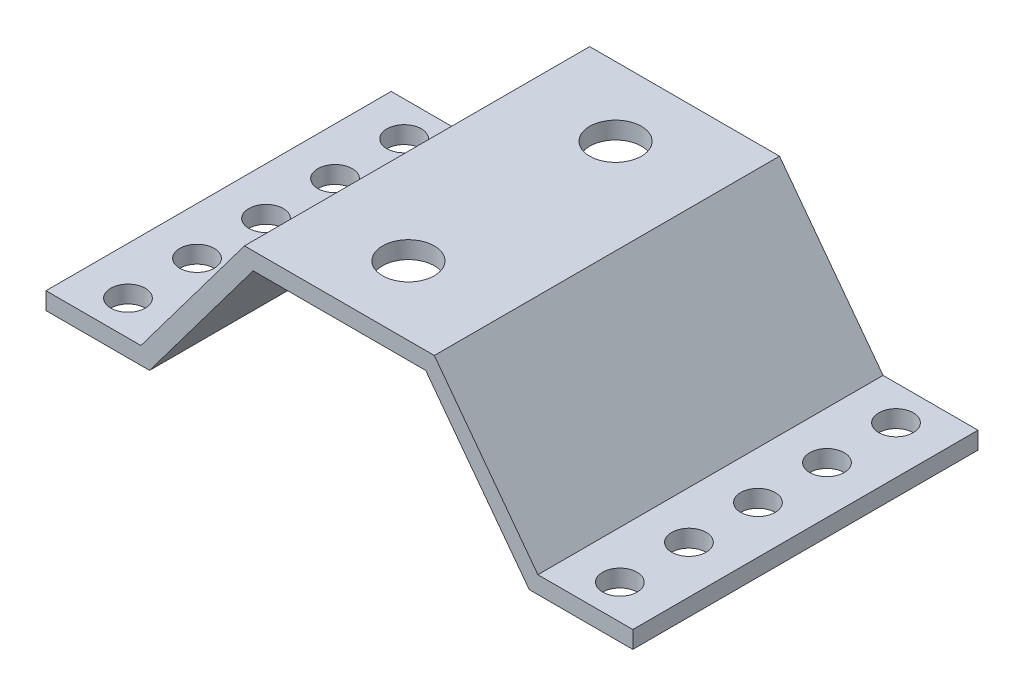
ISO-10303-21;
HEADER;
FILE_DESCRIPTION(('STEP AP214'),'2;1');
FILE_NAME('part.step','',(''),(''),'','','');
FILE_SCHEMA(('AUTOMOTIVE_DESIGN { 1 0 10303 214 1 1 1 1 }'));
ENDSEC;
DATA;
#1=APPLICATION_CONTEXT('core data for automotive mechanical design processes');
#2=APPLICATION_PROTOCOL_DEFINITION('international standard','automotive_design',2000,#1);
#3=PRODUCT_CONTEXT('',#1,'mechanical');
#4=PRODUCT('Part','Part','',(#3));
#5=PRODUCT_RELATED_PRODUCT_CATEGORY('part','',(#4));
#6=PRODUCT_DEFINITION_FORMATION('','',#4);
#7=PRODUCT_DEFINITION_CONTEXT('part definition',#1,'design');
#8=PRODUCT_DEFINITION('design','',#6,#7);
#9=PRODUCT_DEFINITION_SHAPE('','',#8);
#10=(LENGTH_UNIT() NAMED_UNIT(*) SI_UNIT(.MILLI.,.METRE.));
#11=(NAMED_UNIT(*) PLANE_ANGLE_UNIT() SI_UNIT($,.RADIAN.));
#12=(NAMED_UNIT(*) SI_UNIT($,.STERADIAN.) SOLID_ANGLE_UNIT());
#13=UNCERTAINTY_MEASURE_WITH_UNIT(LENGTH_MEASURE(1.E-05),#10,'distance_accuracy_value','');
#14=(GEOMETRIC_REPRESENTATION_CONTEXT(3) GLOBAL_UNCERTAINTY_ASSIGNED_CONTEXT((#13)) GLOBAL_UNIT_ASSIGNED_CONTEXT((#10,
#11,#12)) REPRESENTATION_CONTEXT('',''));
#15=CARTESIAN_POINT('',(0.,0.,0.));
#16=DIRECTION('',(0.,0.,1.));
#17=DIRECTION('',(1.,0.,0.));
#18=AXIS2_PLACEMENT_3D('',#15,#16,#17);
#19=CARTESIAN_POINT('',(-27.5,45.,50.));
#20=DIRECTION('',(0.8,-0.6,0.));
#21=DIRECTION('',(0.6,0.8,0.));
#22=AXIS2_PLACEMENT_3D('',#19,#20,#21);
#23=PLANE('',#22);
#24=DIRECTION('',(-0.6,-0.8,0.));
#25=VECTOR('',#24,1.);
#26=CARTESIAN_POINT('',(-27.5,45.,-50.));
#27=LINE('',#26,#25);
#28=CARTESIAN_POINT('',(-27.5,45.,-50.));
#29=VERTEX_POINT('',#28);
#30=CARTESIAN_POINT('',(-57.5,5.,-50.));
#31=VERTEX_POINT('',#30);
#32=EDGE_CURVE('E161',#29,#31,#27,.T.);
#33=ORIENTED_EDGE('',*,*,#32,.T.);
#34=DIRECTION('',(0.,0.,-1.));
#35=VECTOR('',#34,1.);
#36=CARTESIAN_POINT('',(-57.5,5.,50.));
#37=LINE('',#36,#35);
#38=CARTESIAN_POINT('',(-57.5,5.,50.));
#39=VERTEX_POINT('',#38);
#40=EDGE_CURVE('E11',#39,#31,#37,.T.);
#41=ORIENTED_EDGE('',*,*,#40,.F.);
#42=DIRECTION('',(-0.6,-0.8,0.));
#43=VECTOR('',#42,1.);
#44=CARTESIAN_POINT('',(-27.5,45.,50.));
#45=LINE('',#44,#43);
#46=CARTESIAN_POINT('',(-27.5,45.,50.));
#47=VERTEX_POINT('',#46);
#48=EDGE_CURVE('E184',#47,#39,#45,.T.);
#49=ORIENTED_EDGE('',*,*,#48,.F.);
#50=DIRECTION('',(0.,0.,-1.));
#51=VECTOR('',#50,1.);
#52=CARTESIAN_POINT('',(-27.5,45.,50.));
#53=LINE('',#52,#51);
#54=EDGE_CURVE('E157',#47,#29,#53,.T.);
#55=ORIENTED_EDGE('',*,*,#54,.T.);
#56=EDGE_LOOP('',(#33,#41,#49,#55));
#57=FACE_BOUND('',#56,.T.);
#58=ADVANCED_FACE('F39',(#57),#23,.F.);
#59=CARTESIAN_POINT('',(-57.5,5.,50.));
#60=DIRECTION('',(0.,-1.,0.));
#61=DIRECTION('',(1.,0.,0.));
#62=AXIS2_PLACEMENT_3D('',#59,#60,#61);
#63=PLANE('',#62);
#64=CARTESIAN_POINT('',(-71.25,5.,40.));
#65=DIRECTION('',(0.,-1.,0.));
#66=DIRECTION('',(1.,0.,0.));
#67=AXIS2_PLACEMENT_3D('',#64,#65,#66);
#68=CIRCLE('',#67,5.00000000000001);
#69=CARTESIAN_POINT('',(-66.25,5.,40.));
#70=VERTEX_POINT('',#69);
#71=EDGE_CURVE('E165',#70,#70,#68,.T.);
#72=ORIENTED_EDGE('',*,*,#71,.T.);
#73=EDGE_LOOP('',(#72));
#74=FACE_BOUND('',#73,.T.);
#75=CARTESIAN_POINT('',(-71.25,5.,20.));
#76=DIRECTION('',(0.,-1.,0.));
#77=DIRECTION('',(1.,0.,0.));
#78=AXIS2_PLACEMENT_3D('',#75,#76,#77);
#79=CIRCLE('',#78,5.00000000000001);
#80=CARTESIAN_POINT('',(-66.25,5.,20.));
#81=VERTEX_POINT('',#80);
#82=EDGE_CURVE('E224',#81,#81,#79,.T.);
#83=ORIENTED_EDGE('',*,*,#82,.T.);
#84=EDGE_LOOP('',(#83));
#85=FACE_BOUND('',#84,.T.);
#86=CARTESIAN_POINT('',(-71.25,5.,0.));
#87=DIRECTION('',(0.,-1.,0.));
#88=DIRECTION('',(1.,0.,0.));
#89=AXIS2_PLACEMENT_3D('',#86,#87,#88);
#90=CIRCLE('',#89,5.00000000000001);
#91=CARTESIAN_POINT('',(-66.25,5.,0.));
#92=VERTEX_POINT('',#91);
#93=EDGE_CURVE('E220',#92,#92,#90,.T.);
#94=ORIENTED_EDGE('',*,*,#93,.T.);
#95=EDGE_LOOP('',(#94));
#96=FACE_BOUND('',#95,.T.);
#97=CARTESIAN_POINT('',(-71.25,5.,-20.));
#98=DIRECTION('',(0.,-1.,0.));
#99=DIRECTION('',(1.,0.,0.));
#100=AXIS2_PLACEMENT_3D('',#97,#98,#99);
#101=CIRCLE('',#100,5.00000000000001);
#102=CARTESIAN_POINT('',(-66.25,5.,-20.));
#103=VERTEX_POINT('',#102);
#104=EDGE_CURVE('E216',#103,#103,#101,.T.);
#105=ORIENTED_EDGE('',*,*,#104,.T.);
#106=EDGE_LOOP('',(#105));
#107=FACE_BOUND('',#106,.T.);
#108=CARTESIAN_POINT('',(-71.25,5.,-40.));
#109=DIRECTION('',(0.,-1.,0.));
#110=DIRECTION('',(1.,0.,0.));
#111=AXIS2_PLACEMENT_3D('',#108,#109,#110);
#112=CIRCLE('',#111,5.00000000000001);
#113=CARTESIAN_POINT('',(-66.25,5.,-40.));
#114=VERTEX_POINT('',#113);
#115=EDGE_CURVE('E211',#114,#114,#112,.T.);
#116=ORIENTED_EDGE('',*,*,#115,.T.);
#117=EDGE_LOOP('',(#116));
#118=FACE_BOUND('',#117,.T.);
#119=DIRECTION('',(-1.,0.,0.));
#120=VECTOR('',#119,1.);
#121=CARTESIAN_POINT('',(-57.5,5.,-50.));
#122=LINE('',#121,#120);
#123=CARTESIAN_POINT('',(-85.,5.,-50.));
#124=VERTEX_POINT('',#123);
#125=EDGE_CURVE('E164',#31,#124,#122,.T.);
#126=ORIENTED_EDGE('',*,*,#125,.T.);
#127=DIRECTION('',(0.,0.,-1.));
#128=VECTOR('',#127,1.);
#129=CARTESIAN_POINT('',(-85.,5.,50.));
#130=LINE('',#129,#128);
#131=CARTESIAN_POINT('',(-85.,5.,50.));
#132=VERTEX_POINT('',#131);
#133=EDGE_CURVE('E48',#132,#124,#130,.T.);
#134=ORIENTED_EDGE('',*,*,#133,.F.);
#135=DIRECTION('',(-1.,0.,0.));
#136=VECTOR('',#135,1.);
#137=CARTESIAN_POINT('',(-57.5,5.,50.));
#138=LINE('',#137,#136);
#139=EDGE_CURVE('E112',#39,#132,#138,.T.);
#140=ORIENTED_EDGE('',*,*,#139,.F.);
#141=ORIENTED_EDGE('',*,*,#40,.T.);
#142=EDGE_LOOP('',(#126,#134,#140,#141));
#143=FACE_BOUND('',#142,.T.);
#144=ADVANCED_FACE('F322',(#74,#85,#96,#107,#118,#143),#63,.F.);
#145=CARTESIAN_POINT('',(-85.,5.,50.));
#146=DIRECTION('',(1.,0.,0.));
#147=DIRECTION('',(0.,0.,-1.));
#148=AXIS2_PLACEMENT_3D('',#145,#146,#147);
#149=PLANE('',#148);
#150=DIRECTION('',(0.,-1.,0.));
#151=VECTOR('',#150,1.);
#152=CARTESIAN_POINT('',(-85.,5.,-50.));
#153=LINE('',#152,#151);
#154=CARTESIAN_POINT('',(-85.,0.,-50.));
#155=VERTEX_POINT('',#154);
#156=EDGE_CURVE('E167',#124,#155,#153,.T.);
#157=ORIENTED_EDGE('',*,*,#156,.T.);
#158=DIRECTION('',(0.,0.,-1.));
#159=VECTOR('',#158,1.);
#160=CARTESIAN_POINT('',(-85.,0.,50.));
#161=LINE('',#160,#159);
#162=CARTESIAN_POINT('',(-85.,0.,50.));
#163=VERTEX_POINT('',#162);
#164=EDGE_CURVE('E203',#163,#155,#161,.T.);
#165=ORIENTED_EDGE('',*,*,#164,.F.);
#166=DIRECTION('',(0.,-1.,0.));
#167=VECTOR('',#166,1.);
#168=CARTESIAN_POINT('',(-85.,5.,50.));
#169=LINE('',#168,#167);
#170=EDGE_CURVE('E282',#132,#163,#169,.T.);
#171=ORIENTED_EDGE('',*,*,#170,.F.);
#172=ORIENTED_EDGE('',*,*,#133,.T.);
#173=EDGE_LOOP('',(#157,#165,#171,#172));
#174=FACE_BOUND('',#173,.T.);
#175=ADVANCED_FACE('F326',(#174),#149,.F.);
#176=CARTESIAN_POINT('',(-85.,0.,50.));
#177=DIRECTION('',(0.,1.,0.));
#178=DIRECTION('',(-1.,0.,0.));
#179=AXIS2_PLACEMENT_3D('',#176,#177,#178);
#180=PLANE('',#179);
#181=CARTESIAN_POINT('',(-71.25,0.,40.));
#182=DIRECTION('',(0.,1.,0.));
#183=DIRECTION('',(-1.,0.,0.));
#184=AXIS2_PLACEMENT_3D('',#181,#182,#183);
#185=CIRCLE('',#184,5.00000000000001);
#186=CARTESIAN_POINT('',(-76.25,0.,40.));
#187=VERTEX_POINT('',#186);
#188=EDGE_CURVE('E225',#187,#187,#185,.T.);
#189=ORIENTED_EDGE('',*,*,#188,.T.);
#190=EDGE_LOOP('',(#189));
#191=FACE_BOUND('',#190,.T.);
#192=CARTESIAN_POINT('',(-71.25,0.,20.));
#193=DIRECTION('',(0.,1.,0.));
#194=DIRECTION('',(-1.,0.,0.));
#195=AXIS2_PLACEMENT_3D('',#192,#193,#194);
#196=CIRCLE('',#195,5.00000000000001);
#197=CARTESIAN_POINT('',(-76.25,0.,20.));
#198=VERTEX_POINT('',#197);
#199=EDGE_CURVE('E221',#198,#198,#196,.T.);
#200=ORIENTED_EDGE('',*,*,#199,.T.);
#201=EDGE_LOOP('',(#200));
#202=FACE_BOUND('',#201,.T.);
#203=CARTESIAN_POINT('',(-71.25,0.,0.));
#204=DIRECTION('',(0.,1.,0.));
#205=DIRECTION('',(-1.,0.,0.));
#206=AXIS2_PLACEMENT_3D('',#203,#204,#205);
#207=CIRCLE('',#206,5.00000000000001);
#208=CARTESIAN_POINT('',(-76.25,0.,0.));
#209=VERTEX_POINT('',#208);
#210=EDGE_CURVE('E217',#209,#209,#207,.T.);
#211=ORIENTED_EDGE('',*,*,#210,.T.);
#212=EDGE_LOOP('',(#211));
#213=FACE_BOUND('',#212,.T.);
#214=CARTESIAN_POINT('',(-71.25,0.,-20.));
#215=DIRECTION('',(0.,1.,0.));
#216=DIRECTION('',(-1.,0.,0.));
#217=AXIS2_PLACEMENT_3D('',#214,#215,#216);
#218=CIRCLE('',#217,5.00000000000001);
#219=CARTESIAN_POINT('',(-76.25,0.,-20.));
#220=VERTEX_POINT('',#219);
#221=EDGE_CURVE('E213',#220,#220,#218,.T.);
#222=ORIENTED_EDGE('',*,*,#221,.T.);
#223=EDGE_LOOP('',(#222));
#224=FACE_BOUND('',#223,.T.);
#225=CARTESIAN_POINT('',(-71.25,0.,-40.));
#226=DIRECTION('',(0.,1.,0.));
#227=DIRECTION('',(-1.,0.,0.));
#228=AXIS2_PLACEMENT_3D('',#225,#226,#227);
#229=CIRCLE('',#228,5.00000000000001);
#230=CARTESIAN_POINT('',(-76.25,0.,-40.));
#231=VERTEX_POINT('',#230);
#232=EDGE_CURVE('E208',#231,#231,#229,.T.);
#233=ORIENTED_EDGE('',*,*,#232,.T.);
#234=EDGE_LOOP('',(#233));
#235=FACE_BOUND('',#234,.T.);
#236=DIRECTION('',(1.,0.,0.));
#237=VECTOR('',#236,1.);
#238=CARTESIAN_POINT('',(-85.,0.,-50.));
#239=LINE('',#238,#237);
#240=CARTESIAN_POINT('',(-55.,0.,-50.));
#241=VERTEX_POINT('',#240);
#242=EDGE_CURVE('E169',#155,#241,#239,.T.);
#243=ORIENTED_EDGE('',*,*,#242,.T.);
#244=DIRECTION('',(0.,0.,-1.));
#245=VECTOR('',#244,1.);
#246=CARTESIAN_POINT('',(-55.,0.,50.));
#247=LINE('',#246,#245);
#248=CARTESIAN_POINT('',(-55.,0.,50.));
#249=VERTEX_POINT('',#248);
#250=EDGE_CURVE('E200',#249,#241,#247,.T.);
#251=ORIENTED_EDGE('',*,*,#250,.F.);
#252=DIRECTION('',(1.,0.,0.));
#253=VECTOR('',#252,1.);
#254=CARTESIAN_POINT('',(-85.,0.,50.));
#255=LINE('',#254,#253);
#256=EDGE_CURVE('E284',#163,#249,#255,.T.);
#257=ORIENTED_EDGE('',*,*,#256,.F.);
#258=ORIENTED_EDGE('',*,*,#164,.T.);
#259=EDGE_LOOP('',(#243,#251,#257,#258));
#260=FACE_BOUND('',#259,.T.);
#261=ADVANCED_FACE('F331',(#191,#202,#213,#224,#235,#260),#180,.F.);
#262=CARTESIAN_POINT('',(-55.,0.,50.));
#263=DIRECTION('',(-0.8,0.6,0.));
#264=DIRECTION('',(-0.6,-0.8,0.));
#265=AXIS2_PLACEMENT_3D('',#262,#263,#264);
#266=PLANE('',#265);
#267=DIRECTION('',(0.6,0.8,0.));
#268=VECTOR('',#267,1.);
#269=CARTESIAN_POINT('',(-55.,0.,-50.));
#270=LINE('',#269,#268);
#271=CARTESIAN_POINT('',(-25.,40.,-50.));
#272=VERTEX_POINT('',#271);
#273=EDGE_CURVE('E171',#241,#272,#270,.T.);
#274=ORIENTED_EDGE('',*,*,#273,.T.);
#275=DIRECTION('',(0.,0.,-1.));
#276=VECTOR('',#275,1.);
#277=CARTESIAN_POINT('',(-25.,40.,50.));
#278=LINE('',#277,#276);
#279=CARTESIAN_POINT('',(-25.,40.,50.));
#280=VERTEX_POINT('',#279);
#281=EDGE_CURVE('E197',#280,#272,#278,.T.);
#282=ORIENTED_EDGE('',*,*,#281,.F.);
#283=DIRECTION('',(0.6,0.8,0.));
#284=VECTOR('',#283,1.);
#285=CARTESIAN_POINT('',(-55.,0.,50.));
#286=LINE('',#285,#284);
#287=EDGE_CURVE('E286',#249,#280,#286,.T.);
#288=ORIENTED_EDGE('',*,*,#287,.F.);
#289=ORIENTED_EDGE('',*,*,#250,.T.);
#290=EDGE_LOOP('',(#274,#282,#288,#289));
#291=FACE_BOUND('',#290,.T.);
#292=ADVANCED_FACE('F338',(#291),#266,.F.);
#293=CARTESIAN_POINT('',(-25.,40.,50.));
#294=DIRECTION('',(0.,1.,0.));
#295=DIRECTION('',(0.,0.,1.));
#296=AXIS2_PLACEMENT_3D('',#293,#294,#295);
#297=PLANE('',#296);
#298=CARTESIAN_POINT('',(0.,40.,30.));
#299=DIRECTION('',(0.,1.,0.));
#300=DIRECTION('',(0.,0.,1.));
#301=AXIS2_PLACEMENT_3D('',#298,#299,#300);
#302=CIRCLE('',#301,7.5);
#303=CARTESIAN_POINT('',(0.,40.,37.5));
#304=VERTEX_POINT('',#303);
#305=EDGE_CURVE('E232',#304,#304,#302,.T.);
#306=ORIENTED_EDGE('',*,*,#305,.T.);
#307=EDGE_LOOP('',(#306));
#308=FACE_BOUND('',#307,.T.);
#309=CARTESIAN_POINT('',(0.,40.,-30.));
#310=DIRECTION('',(0.,1.,0.));
#311=DIRECTION('',(0.,0.,1.));
#312=AXIS2_PLACEMENT_3D('',#309,#310,#311);
#313=CIRCLE('',#312,7.5);
#314=CARTESIAN_POINT('',(0.,40.,-22.5));
#315=VERTEX_POINT('',#314);
#316=EDGE_CURVE('E249',#315,#315,#313,.T.);
#317=ORIENTED_EDGE('',*,*,#316,.T.);
#318=EDGE_LOOP('',(#317));
#319=FACE_BOUND('',#318,.T.);
#320=DIRECTION('',(1.,0.,0.));
#321=VECTOR('',#320,1.);
#322=CARTESIAN_POINT('',(-25.,40.,-50.));
#323=LINE('',#322,#321);
#324=CARTESIAN_POINT('',(25.,40.,-50.));
#325=VERTEX_POINT('',#324);
#326=EDGE_CURVE('E173',#272,#325,#323,.T.);
#327=ORIENTED_EDGE('',*,*,#326,.T.);
#328=DIRECTION('',(0.,0.,-1.));
#329=VECTOR('',#328,1.);
#330=CARTESIAN_POINT('',(25.,40.,50.));
#331=LINE('',#330,#329);
#332=CARTESIAN_POINT('',(25.,40.,50.));
#333=VERTEX_POINT('',#332);
#334=EDGE_CURVE('E194',#333,#325,#331,.T.);
#335=ORIENTED_EDGE('',*,*,#334,.F.);
#336=DIRECTION('',(1.,0.,0.));
#337=VECTOR('',#336,1.);
#338=CARTESIAN_POINT('',(-25.,40.,50.));
#339=LINE('',#338,#337);
#340=EDGE_CURVE('E288',#280,#333,#339,.T.);
#341=ORIENTED_EDGE('',*,*,#340,.F.);
#342=ORIENTED_EDGE('',*,*,#281,.T.);
#343=EDGE_LOOP('',(#327,#335,#341,#342));
#344=FACE_BOUND('',#343,.T.);
#345=ADVANCED_FACE('F342',(#308,#319,#344),#297,.F.);
#346=CARTESIAN_POINT('',(55.,0.,50.));
#347=DIRECTION('',(0.8,0.6,0.));
#348=DIRECTION('',(-0.6,0.8,0.));
#349=AXIS2_PLACEMENT_3D('',#346,#347,#348);
#350=PLANE('',#349);
#351=DIRECTION('',(0.6,-0.8,0.));
#352=VECTOR('',#351,1.);
#353=CARTESIAN_POINT('',(55.,0.,-50.));
#354=LINE('',#353,#352);
#355=CARTESIAN_POINT('',(55.,0.,-50.));
#356=VERTEX_POINT('',#355);
#357=EDGE_CURVE('E175',#325,#356,#354,.T.);
#358=ORIENTED_EDGE('',*,*,#357,.T.);
#359=DIRECTION('',(0.,0.,-1.));
#360=VECTOR('',#359,1.);
#361=CARTESIAN_POINT('',(55.,0.,50.));
#362=LINE('',#361,#360);
#363=CARTESIAN_POINT('',(55.,0.,50.));
#364=VERTEX_POINT('',#363);
#365=EDGE_CURVE('E191',#364,#356,#362,.T.);
#366=ORIENTED_EDGE('',*,*,#365,.F.);
#367=DIRECTION('',(0.6,-0.8,0.));
#368=VECTOR('',#367,1.);
#369=CARTESIAN_POINT('',(55.,0.,50.));
#370=LINE('',#369,#368);
#371=EDGE_CURVE('E290',#333,#364,#370,.T.);
#372=ORIENTED_EDGE('',*,*,#371,.F.);
#373=ORIENTED_EDGE('',*,*,#334,.T.);
#374=EDGE_LOOP('',(#358,#366,#372,#373));
#375=FACE_BOUND('',#374,.T.);
#376=ADVANCED_FACE('F346',(#375),#350,.F.);
#377=CARTESIAN_POINT('',(85.,0.,50.));
#378=DIRECTION('',(0.,1.,0.));
#379=DIRECTION('',(-1.,0.,0.));
#380=AXIS2_PLACEMENT_3D('',#377,#378,#379);
#381=PLANE('',#380);
#382=CARTESIAN_POINT('',(71.25,0.,40.));
#383=DIRECTION('',(0.,1.,0.));
#384=DIRECTION('',(-1.,0.,0.));
#385=AXIS2_PLACEMENT_3D('',#382,#383,#384);
#386=CIRCLE('',#385,5.00000000000001);
#387=CARTESIAN_POINT('',(66.25,0.,40.));
#388=VERTEX_POINT('',#387);
#389=EDGE_CURVE('E212',#388,#388,#386,.F.);
#390=ORIENTED_EDGE('',*,*,#389,.F.);
#391=EDGE_LOOP('',(#390));
#392=FACE_BOUND('',#391,.T.);
#393=CARTESIAN_POINT('',(71.25,0.,20.));
#394=DIRECTION('',(0.,1.,0.));
#395=DIRECTION('',(-1.,0.,0.));
#396=AXIS2_PLACEMENT_3D('',#393,#394,#395);
#397=CIRCLE('',#396,5.00000000000001);
#398=CARTESIAN_POINT('',(66.25,0.,20.));
#399=VERTEX_POINT('',#398);
#400=EDGE_CURVE('E244',#399,#399,#397,.F.);
#401=ORIENTED_EDGE('',*,*,#400,.F.);
#402=EDGE_LOOP('',(#401));
#403=FACE_BOUND('',#402,.T.);
#404=CARTESIAN_POINT('',(71.25,0.,0.));
#405=DIRECTION('',(0.,1.,0.));
#406=DIRECTION('',(-1.,0.,0.));
#407=AXIS2_PLACEMENT_3D('',#404,#405,#406);
#408=CIRCLE('',#407,5.00000000000001);
#409=CARTESIAN_POINT('',(66.25,0.,0.));
#410=VERTEX_POINT('',#409);
#411=EDGE_CURVE('E240',#410,#410,#408,.F.);
#412=ORIENTED_EDGE('',*,*,#411,.F.);
#413=EDGE_LOOP('',(#412));
#414=FACE_BOUND('',#413,.T.);
#415=CARTESIAN_POINT('',(71.25,0.,-20.));
#416=DIRECTION('',(0.,1.,0.));
#417=DIRECTION('',(-1.,0.,0.));
#418=AXIS2_PLACEMENT_3D('',#415,#416,#417);
#419=CIRCLE('',#418,5.00000000000001);
#420=CARTESIAN_POINT('',(66.25,0.,-20.));
#421=VERTEX_POINT('',#420);
#422=EDGE_CURVE('E236',#421,#421,#419,.F.);
#423=ORIENTED_EDGE('',*,*,#422,.F.);
#424=EDGE_LOOP('',(#423));
#425=FACE_BOUND('',#424,.T.);
#426=CARTESIAN_POINT('',(71.25,0.,-40.));
#427=DIRECTION('',(0.,1.,0.));
#428=DIRECTION('',(-1.,0.,0.));
#429=AXIS2_PLACEMENT_3D('',#426,#427,#428);
#430=CIRCLE('',#429,5.00000000000001);
#431=CARTESIAN_POINT('',(66.25,0.,-40.));
#432=VERTEX_POINT('',#431);
#433=EDGE_CURVE('E231',#432,#432,#430,.F.);
#434=ORIENTED_EDGE('',*,*,#433,.F.);
#435=EDGE_LOOP('',(#434));
#436=FACE_BOUND('',#435,.T.);
#437=DIRECTION('',(1.,0.,0.));
#438=VECTOR('',#437,1.);
#439=CARTESIAN_POINT('',(85.,0.,-50.));
#440=LINE('',#439,#438);
#441=CARTESIAN_POINT('',(85.,0.,-50.));
#442=VERTEX_POINT('',#441);
#443=EDGE_CURVE('E177',#356,#442,#440,.T.);
#444=ORIENTED_EDGE('',*,*,#443,.T.);
#445=DIRECTION('',(0.,0.,-1.));
#446=VECTOR('',#445,1.);
#447=CARTESIAN_POINT('',(85.,0.,50.));
#448=LINE('',#447,#446);
#449=CARTESIAN_POINT('',(85.,0.,50.));
#450=VERTEX_POINT('',#449);
#451=EDGE_CURVE('E188',#450,#442,#448,.T.);
#452=ORIENTED_EDGE('',*,*,#451,.F.);
#453=DIRECTION('',(1.,0.,0.));
#454=VECTOR('',#453,1.);
#455=CARTESIAN_POINT('',(85.,0.,50.));
#456=LINE('',#455,#454);
#457=EDGE_CURVE('E292',#364,#450,#456,.T.);
#458=ORIENTED_EDGE('',*,*,#457,.F.);
#459=ORIENTED_EDGE('',*,*,#365,.T.);
#460=EDGE_LOOP('',(#444,#452,#458,#459));
#461=FACE_BOUND('',#460,.T.);
#462=ADVANCED_FACE('F298',(#392,#403,#414,#425,#436,#461),#381,.F.);
#463=CARTESIAN_POINT('',(85.,5.,50.));
#464=DIRECTION('',(-1.,0.,0.));
#465=DIRECTION('',(0.,0.,1.));
#466=AXIS2_PLACEMENT_3D('',#463,#464,#465);
#467=PLANE('',#466);
#468=DIRECTION('',(0.,1.,0.));
#469=VECTOR('',#468,1.);
#470=CARTESIAN_POINT('',(85.,5.,-50.));
#471=LINE('',#470,#469);
#472=CARTESIAN_POINT('',(85.,5.,-50.));
#473=VERTEX_POINT('',#472);
#474=EDGE_CURVE('E179',#442,#473,#471,.T.);
#475=ORIENTED_EDGE('',*,*,#474,.T.);
#476=DIRECTION('',(0.,0.,-1.));
#477=VECTOR('',#476,1.);
#478=CARTESIAN_POINT('',(85.,5.,50.));
#479=LINE('',#478,#477);
#480=CARTESIAN_POINT('',(85.,5.,50.));
#481=VERTEX_POINT('',#480);
#482=EDGE_CURVE('E152',#481,#473,#479,.T.);
#483=ORIENTED_EDGE('',*,*,#482,.F.);
#484=DIRECTION('',(0.,1.,0.));
#485=VECTOR('',#484,1.);
#486=CARTESIAN_POINT('',(85.,5.,50.));
#487=LINE('',#486,#485);
#488=EDGE_CURVE('E143',#450,#481,#487,.T.);
#489=ORIENTED_EDGE('',*,*,#488,.F.);
#490=ORIENTED_EDGE('',*,*,#451,.T.);
#491=EDGE_LOOP('',(#475,#483,#489,#490));
#492=FACE_BOUND('',#491,.T.);
#493=ADVANCED_FACE('F302',(#492),#467,.F.);
#494=CARTESIAN_POINT('',(57.5,5.,50.));
#495=DIRECTION('',(0.,-1.,0.));
#496=DIRECTION('',(1.,0.,0.));
#497=AXIS2_PLACEMENT_3D('',#494,#495,#496);
#498=PLANE('',#497);
#499=CARTESIAN_POINT('',(71.25,5.,40.));
#500=DIRECTION('',(0.,-1.,0.));
#501=DIRECTION('',(1.,0.,0.));
#502=AXIS2_PLACEMENT_3D('',#499,#500,#501);
#503=CIRCLE('',#502,5.00000000000001);
#504=CARTESIAN_POINT('',(76.25,5.,40.));
#505=VERTEX_POINT('',#504);
#506=EDGE_CURVE('E245',#505,#505,#503,.F.);
#507=ORIENTED_EDGE('',*,*,#506,.F.);
#508=EDGE_LOOP('',(#507));
#509=FACE_BOUND('',#508,.T.);
#510=CARTESIAN_POINT('',(71.25,5.,20.));
#511=DIRECTION('',(0.,-1.,0.));
#512=DIRECTION('',(1.,0.,0.));
#513=AXIS2_PLACEMENT_3D('',#510,#511,#512);
#514=CIRCLE('',#513,5.00000000000001);
#515=CARTESIAN_POINT('',(76.25,5.,20.));
#516=VERTEX_POINT('',#515);
#517=EDGE_CURVE('E241',#516,#516,#514,.F.);
#518=ORIENTED_EDGE('',*,*,#517,.F.);
#519=EDGE_LOOP('',(#518));
#520=FACE_BOUND('',#519,.T.);
#521=CARTESIAN_POINT('',(71.25,5.,0.));
#522=DIRECTION('',(0.,-1.,0.));
#523=DIRECTION('',(1.,0.,0.));
#524=AXIS2_PLACEMENT_3D('',#521,#522,#523);
#525=CIRCLE('',#524,5.00000000000001);
#526=CARTESIAN_POINT('',(76.25,5.,0.));
#527=VERTEX_POINT('',#526);
#528=EDGE_CURVE('E237',#527,#527,#525,.F.);
#529=ORIENTED_EDGE('',*,*,#528,.F.);
#530=EDGE_LOOP('',(#529));
#531=FACE_BOUND('',#530,.T.);
#532=CARTESIAN_POINT('',(71.25,5.,-20.));
#533=DIRECTION('',(0.,-1.,0.));
#534=DIRECTION('',(1.,0.,0.));
#535=AXIS2_PLACEMENT_3D('',#532,#533,#534);
#536=CIRCLE('',#535,5.00000000000001);
#537=CARTESIAN_POINT('',(76.25,5.,-20.));
#538=VERTEX_POINT('',#537);
#539=EDGE_CURVE('E233',#538,#538,#536,.F.);
#540=ORIENTED_EDGE('',*,*,#539,.F.);
#541=EDGE_LOOP('',(#540));
#542=FACE_BOUND('',#541,.T.);
#543=CARTESIAN_POINT('',(71.25,5.,-40.));
#544=DIRECTION('',(0.,-1.,0.));
#545=DIRECTION('',(1.,0.,0.));
#546=AXIS2_PLACEMENT_3D('',#543,#544,#545);
#547=CIRCLE('',#546,5.00000000000001);
#548=CARTESIAN_POINT('',(76.25,5.,-40.));
#549=VERTEX_POINT('',#548);
#550=EDGE_CURVE('E228',#549,#549,#547,.F.);
#551=ORIENTED_EDGE('',*,*,#550,.F.);
#552=EDGE_LOOP('',(#551));
#553=FACE_BOUND('',#552,.T.);
#554=DIRECTION('',(-1.,0.,0.));
#555=VECTOR('',#554,1.);
#556=CARTESIAN_POINT('',(57.5,5.,-50.));
#557=LINE('',#556,#555);
#558=CARTESIAN_POINT('',(57.5,5.,-50.));
#559=VERTEX_POINT('',#558);
#560=EDGE_CURVE('E151',#473,#559,#557,.T.);
#561=ORIENTED_EDGE('',*,*,#560,.T.);
#562=DIRECTION('',(0.,0.,-1.));
#563=VECTOR('',#562,1.);
#564=CARTESIAN_POINT('',(57.5,5.,50.));
#565=LINE('',#564,#563);
#566=CARTESIAN_POINT('',(57.5,5.,50.));
#567=VERTEX_POINT('',#566);
#568=EDGE_CURVE('E148',#567,#559,#565,.T.);
#569=ORIENTED_EDGE('',*,*,#568,.F.);
#570=DIRECTION('',(-1.,0.,0.));
#571=VECTOR('',#570,1.);
#572=CARTESIAN_POINT('',(57.5,5.,50.));
#573=LINE('',#572,#571);
#574=EDGE_CURVE('E137',#481,#567,#573,.T.);
#575=ORIENTED_EDGE('',*,*,#574,.F.);
#576=ORIENTED_EDGE('',*,*,#482,.T.);
#577=EDGE_LOOP('',(#561,#569,#575,#576));
#578=FACE_BOUND('',#577,.T.);
#579=ADVANCED_FACE('F149',(#509,#520,#531,#542,#553,#578),#498,.F.);
#580=CARTESIAN_POINT('',(27.5,45.,50.));
#581=DIRECTION('',(-0.8,-0.6,0.));
#582=DIRECTION('',(0.6,-0.8,0.));
#583=AXIS2_PLACEMENT_3D('',#580,#581,#582);
#584=PLANE('',#583);
#585=DIRECTION('',(-0.6,0.8,0.));
#586=VECTOR('',#585,1.);
#587=CARTESIAN_POINT('',(27.5,45.,-50.));
#588=LINE('',#587,#586);
#589=CARTESIAN_POINT('',(27.5,45.,-50.));
#590=VERTEX_POINT('',#589);
#591=EDGE_CURVE('E98',#559,#590,#588,.T.);
#592=ORIENTED_EDGE('',*,*,#591,.T.);
#593=DIRECTION('',(0.,0.,-1.));
#594=VECTOR('',#593,1.);
#595=CARTESIAN_POINT('',(27.5,45.,50.));
#596=LINE('',#595,#594);
#597=CARTESIAN_POINT('',(27.5,45.,50.));
#598=VERTEX_POINT('',#597);
#599=EDGE_CURVE('E153',#598,#590,#596,.T.);
#600=ORIENTED_EDGE('',*,*,#599,.F.);
#601=DIRECTION('',(-0.6,0.8,0.));
#602=VECTOR('',#601,1.);
#603=CARTESIAN_POINT('',(27.5,45.,50.));
#604=LINE('',#603,#602);
#605=EDGE_CURVE('E141',#567,#598,#604,.T.);
#606=ORIENTED_EDGE('',*,*,#605,.F.);
#607=ORIENTED_EDGE('',*,*,#568,.T.);
#608=EDGE_LOOP('',(#592,#600,#606,#607));
#609=FACE_BOUND('',#608,.T.);
#610=ADVANCED_FACE('F155',(#609),#584,.F.);
#611=CARTESIAN_POINT('',(27.5,45.,50.));
#612=DIRECTION('',(0.,-1.,0.));
#613=DIRECTION('',(0.,0.,-1.));
#614=AXIS2_PLACEMENT_3D('',#611,#612,#613);
#615=PLANE('',#614);
#616=CARTESIAN_POINT('',(0.,45.,30.));
#617=DIRECTION('',(0.,-1.,0.));
#618=DIRECTION('',(0.,0.,-1.));
#619=AXIS2_PLACEMENT_3D('',#616,#617,#618);
#620=CIRCLE('',#619,7.5);
#621=CARTESIAN_POINT('',(0.,45.,22.5));
#622=VERTEX_POINT('',#621);
#623=EDGE_CURVE('E42',#622,#622,#620,.T.);
#624=ORIENTED_EDGE('',*,*,#623,.T.);
#625=EDGE_LOOP('',(#624));
#626=FACE_BOUND('',#625,.T.);
#627=CARTESIAN_POINT('',(0.,45.,-30.));
#628=DIRECTION('',(0.,-1.,0.));
#629=DIRECTION('',(0.,0.,-1.));
#630=AXIS2_PLACEMENT_3D('',#627,#628,#629);
#631=CIRCLE('',#630,7.5);
#632=CARTESIAN_POINT('',(0.,45.,-37.5));
#633=VERTEX_POINT('',#632);
#634=EDGE_CURVE('E247',#633,#633,#631,.T.);
#635=ORIENTED_EDGE('',*,*,#634,.T.);
#636=EDGE_LOOP('',(#635));
#637=FACE_BOUND('',#636,.T.);
#638=DIRECTION('',(-1.,0.,0.));
#639=VECTOR('',#638,1.);
#640=CARTESIAN_POINT('',(27.5,45.,-50.));
#641=LINE('',#640,#639);
#642=EDGE_CURVE('E104',#590,#29,#641,.T.);
#643=ORIENTED_EDGE('',*,*,#642,.T.);
#644=ORIENTED_EDGE('',*,*,#54,.F.);
#645=DIRECTION('',(-1.,0.,0.));
#646=VECTOR('',#645,1.);
#647=CARTESIAN_POINT('',(27.5,45.,50.));
#648=LINE('',#647,#646);
#649=EDGE_CURVE('E57',#598,#47,#648,.T.);
#650=ORIENTED_EDGE('',*,*,#649,.F.);
#651=ORIENTED_EDGE('',*,*,#599,.T.);
#652=EDGE_LOOP('',(#643,#644,#650,#651));
#653=FACE_BOUND('',#652,.T.);
#654=ADVANCED_FACE('F310',(#626,#637,#653),#615,.F.);
#655=CARTESIAN_POINT('',(0.,0.,50.));
#656=DIRECTION('',(0.,0.,-1.));
#657=DIRECTION('',(-1.,0.,0.));
#658=AXIS2_PLACEMENT_3D('',#655,#656,#657);
#659=PLANE('',#658);
#660=ORIENTED_EDGE('',*,*,#48,.T.);
#661=ORIENTED_EDGE('',*,*,#139,.T.);
#662=ORIENTED_EDGE('',*,*,#170,.T.);
#663=ORIENTED_EDGE('',*,*,#256,.T.);
#664=ORIENTED_EDGE('',*,*,#287,.T.);
#665=ORIENTED_EDGE('',*,*,#340,.T.);
#666=ORIENTED_EDGE('',*,*,#371,.T.);
#667=ORIENTED_EDGE('',*,*,#457,.T.);
#668=ORIENTED_EDGE('',*,*,#488,.T.);
#669=ORIENTED_EDGE('',*,*,#574,.T.);
#670=ORIENTED_EDGE('',*,*,#605,.T.);
#671=ORIENTED_EDGE('',*,*,#649,.T.);
#672=EDGE_LOOP('',(#660,#661,#662,#663,#664,#665,#666,#667,#668,#669,#670,#671));
#673=FACE_BOUND('',#672,.T.);
#674=ADVANCED_FACE('F139',(#673),#659,.F.);
#675=CARTESIAN_POINT('',(0.,0.,-50.));
#676=DIRECTION('',(0.,0.,-1.));
#677=DIRECTION('',(-1.,0.,0.));
#678=AXIS2_PLACEMENT_3D('',#675,#676,#677);
#679=PLANE('',#678);
#680=ORIENTED_EDGE('',*,*,#32,.F.);
#681=ORIENTED_EDGE('',*,*,#642,.F.);
#682=ORIENTED_EDGE('',*,*,#591,.F.);
#683=ORIENTED_EDGE('',*,*,#560,.F.);
#684=ORIENTED_EDGE('',*,*,#474,.F.);
#685=ORIENTED_EDGE('',*,*,#443,.F.);
#686=ORIENTED_EDGE('',*,*,#357,.F.);
#687=ORIENTED_EDGE('',*,*,#326,.F.);
#688=ORIENTED_EDGE('',*,*,#273,.F.);
#689=ORIENTED_EDGE('',*,*,#242,.F.);
#690=ORIENTED_EDGE('',*,*,#156,.F.);
#691=ORIENTED_EDGE('',*,*,#125,.F.);
#692=EDGE_LOOP('',(#680,#681,#682,#683,#684,#685,#686,#687,#688,#689,#690,#691));
#693=FACE_BOUND('',#692,.T.);
#694=ADVANCED_FACE('F305',(#693),#679,.T.);
#695=CARTESIAN_POINT('',(-71.25,-20.,-40.));
#696=DIRECTION('',(0.,1.,0.));
#697=DIRECTION('',(-1.,0.,0.));
#698=AXIS2_PLACEMENT_3D('',#695,#696,#697);
#699=CYLINDRICAL_SURFACE('',#698,5.00000000000001);
#700=ORIENTED_EDGE('',*,*,#232,.F.);
#701=EDGE_LOOP('',(#700));
#702=FACE_BOUND('',#701,.T.);
#703=ORIENTED_EDGE('',*,*,#115,.F.);
#704=EDGE_LOOP('',(#703));
#705=FACE_BOUND('',#704,.T.);
#706=ADVANCED_FACE('F400',(#702,#705),#699,.F.);
#707=CARTESIAN_POINT('',(-71.25,-20.,-20.));
#708=DIRECTION('',(0.,1.,0.));
#709=DIRECTION('',(-1.,0.,0.));
#710=AXIS2_PLACEMENT_3D('',#707,#708,#709);
#711=CYLINDRICAL_SURFACE('',#710,5.00000000000001);
#712=ORIENTED_EDGE('',*,*,#221,.F.);
#713=EDGE_LOOP('',(#712));
#714=FACE_BOUND('',#713,.T.);
#715=ORIENTED_EDGE('',*,*,#104,.F.);
#716=EDGE_LOOP('',(#715));
#717=FACE_BOUND('',#716,.T.);
#718=ADVANCED_FACE('F396',(#714,#717),#711,.F.);
#719=CARTESIAN_POINT('',(-71.25,-20.,0.));
#720=DIRECTION('',(0.,1.,0.));
#721=DIRECTION('',(-1.,0.,0.));
#722=AXIS2_PLACEMENT_3D('',#719,#720,#721);
#723=CYLINDRICAL_SURFACE('',#722,5.00000000000001);
#724=ORIENTED_EDGE('',*,*,#210,.F.);
#725=EDGE_LOOP('',(#724));
#726=FACE_BOUND('',#725,.T.);
#727=ORIENTED_EDGE('',*,*,#93,.F.);
#728=EDGE_LOOP('',(#727));
#729=FACE_BOUND('',#728,.T.);
#730=ADVANCED_FACE('F392',(#726,#729),#723,.F.);
#731=CARTESIAN_POINT('',(-71.25,-20.,20.));
#732=DIRECTION('',(0.,1.,0.));
#733=DIRECTION('',(-1.,0.,0.));
#734=AXIS2_PLACEMENT_3D('',#731,#732,#733);
#735=CYLINDRICAL_SURFACE('',#734,5.00000000000001);
#736=ORIENTED_EDGE('',*,*,#199,.F.);
#737=EDGE_LOOP('',(#736));
#738=FACE_BOUND('',#737,.T.);
#739=ORIENTED_EDGE('',*,*,#82,.F.);
#740=EDGE_LOOP('',(#739));
#741=FACE_BOUND('',#740,.T.);
#742=ADVANCED_FACE('F385',(#738,#741),#735,.F.);
#743=CARTESIAN_POINT('',(-71.25,-20.,40.));
#744=DIRECTION('',(0.,1.,0.));
#745=DIRECTION('',(-1.,0.,0.));
#746=AXIS2_PLACEMENT_3D('',#743,#744,#745);
#747=CYLINDRICAL_SURFACE('',#746,5.00000000000001);
#748=ORIENTED_EDGE('',*,*,#188,.F.);
#749=EDGE_LOOP('',(#748));
#750=FACE_BOUND('',#749,.T.);
#751=ORIENTED_EDGE('',*,*,#71,.F.);
#752=EDGE_LOOP('',(#751));
#753=FACE_BOUND('',#752,.T.);
#754=ADVANCED_FACE('F374',(#750,#753),#747,.F.);
#755=CARTESIAN_POINT('',(71.25,-20.,-40.));
#756=DIRECTION('',(0.,1.,0.));
#757=DIRECTION('',(-1.,0.,0.));
#758=AXIS2_PLACEMENT_3D('',#755,#756,#757);
#759=CYLINDRICAL_SURFACE('',#758,5.00000000000001);
#760=ORIENTED_EDGE('',*,*,#550,.T.);
#761=EDGE_LOOP('',(#760));
#762=FACE_BOUND('',#761,.T.);
#763=ORIENTED_EDGE('',*,*,#433,.T.);
#764=EDGE_LOOP('',(#763));
#765=FACE_BOUND('',#764,.T.);
#766=ADVANCED_FACE('F370',(#762,#765),#759,.F.);
#767=CARTESIAN_POINT('',(71.25,-20.,-20.));
#768=DIRECTION('',(0.,1.,0.));
#769=DIRECTION('',(-1.,0.,0.));
#770=AXIS2_PLACEMENT_3D('',#767,#768,#769);
#771=CYLINDRICAL_SURFACE('',#770,5.00000000000001);
#772=ORIENTED_EDGE('',*,*,#539,.T.);
#773=EDGE_LOOP('',(#772));
#774=FACE_BOUND('',#773,.T.);
#775=ORIENTED_EDGE('',*,*,#422,.T.);
#776=EDGE_LOOP('',(#775));
#777=FACE_BOUND('',#776,.T.);
#778=ADVANCED_FACE('F373',(#774,#777),#771,.F.);
#779=CARTESIAN_POINT('',(71.25,-20.,0.));
#780=DIRECTION('',(0.,1.,0.));
#781=DIRECTION('',(-1.,0.,0.));
#782=AXIS2_PLACEMENT_3D('',#779,#780,#781);
#783=CYLINDRICAL_SURFACE('',#782,5.00000000000001);
#784=ORIENTED_EDGE('',*,*,#528,.T.);
#785=EDGE_LOOP('',(#784));
#786=FACE_BOUND('',#785,.T.);
#787=ORIENTED_EDGE('',*,*,#411,.T.);
#788=EDGE_LOOP('',(#787));
#789=FACE_BOUND('',#788,.T.);
#790=ADVANCED_FACE('F382',(#786,#789),#783,.F.);
#791=CARTESIAN_POINT('',(71.25,-20.,20.));
#792=DIRECTION('',(0.,1.,0.));
#793=DIRECTION('',(-1.,0.,0.));
#794=AXIS2_PLACEMENT_3D('',#791,#792,#793);
#795=CYLINDRICAL_SURFACE('',#794,5.00000000000001);
#796=ORIENTED_EDGE('',*,*,#517,.T.);
#797=EDGE_LOOP('',(#796));
#798=FACE_BOUND('',#797,.T.);
#799=ORIENTED_EDGE('',*,*,#400,.T.);
#800=EDGE_LOOP('',(#799));
#801=FACE_BOUND('',#800,.T.);
#802=ADVANCED_FACE('F467',(#798,#801),#795,.F.);
#803=CARTESIAN_POINT('',(71.25,-20.,40.));
#804=DIRECTION('',(0.,1.,0.));
#805=DIRECTION('',(-1.,0.,0.));
#806=AXIS2_PLACEMENT_3D('',#803,#804,#805);
#807=CYLINDRICAL_SURFACE('',#806,5.00000000000001);
#808=ORIENTED_EDGE('',*,*,#506,.T.);
#809=EDGE_LOOP('',(#808));
#810=FACE_BOUND('',#809,.T.);
#811=ORIENTED_EDGE('',*,*,#389,.T.);
#812=EDGE_LOOP('',(#811));
#813=FACE_BOUND('',#812,.T.);
#814=ADVANCED_FACE('F477',(#810,#813),#807,.F.);
#815=CARTESIAN_POINT('',(0.,20.,-30.));
#816=DIRECTION('',(0.,1.,0.));
#817=DIRECTION('',(0.,0.,1.));
#818=AXIS2_PLACEMENT_3D('',#815,#816,#817);
#819=CYLINDRICAL_SURFACE('',#818,7.5);
#820=ORIENTED_EDGE('',*,*,#634,.F.);
#821=EDGE_LOOP('',(#820));
#822=FACE_BOUND('',#821,.T.);
#823=ORIENTED_EDGE('',*,*,#316,.F.);
#824=EDGE_LOOP('',(#823));
#825=FACE_BOUND('',#824,.T.);
#826=ADVANCED_FACE('F488',(#822,#825),#819,.F.);
#827=CARTESIAN_POINT('',(0.,20.,30.));
#828=DIRECTION('',(0.,1.,0.));
#829=DIRECTION('',(0.,0.,1.));
#830=AXIS2_PLACEMENT_3D('',#827,#828,#829);
#831=CYLINDRICAL_SURFACE('',#830,7.5);
#832=ORIENTED_EDGE('',*,*,#623,.F.);
#833=EDGE_LOOP('',(#832));
#834=FACE_BOUND('',#833,.T.);
#835=ORIENTED_EDGE('',*,*,#305,.F.);
#836=EDGE_LOOP('',(#835));
#837=FACE_BOUND('',#836,.T.);
#838=ADVANCED_FACE('F513',(#834,#837),#831,.F.);
#839=CLOSED_SHELL('',(#58,#144,#175,#261,#292,#345,#376,#462,#493,#579,#610,#654,#674,#694,#706,
#718,#730,#742,#754,#766,#778,#790,#802,#814,#826,#838));
#840=MANIFOLD_SOLID_BREP('B2',#839);
#841=ADVANCED_BREP_SHAPE_REPRESENTATION('',(#18,#840),#14);
#842=SHAPE_DEFINITION_REPRESENTATION(#9,#841);
ENDSEC;
END-ISO-10303-21;
